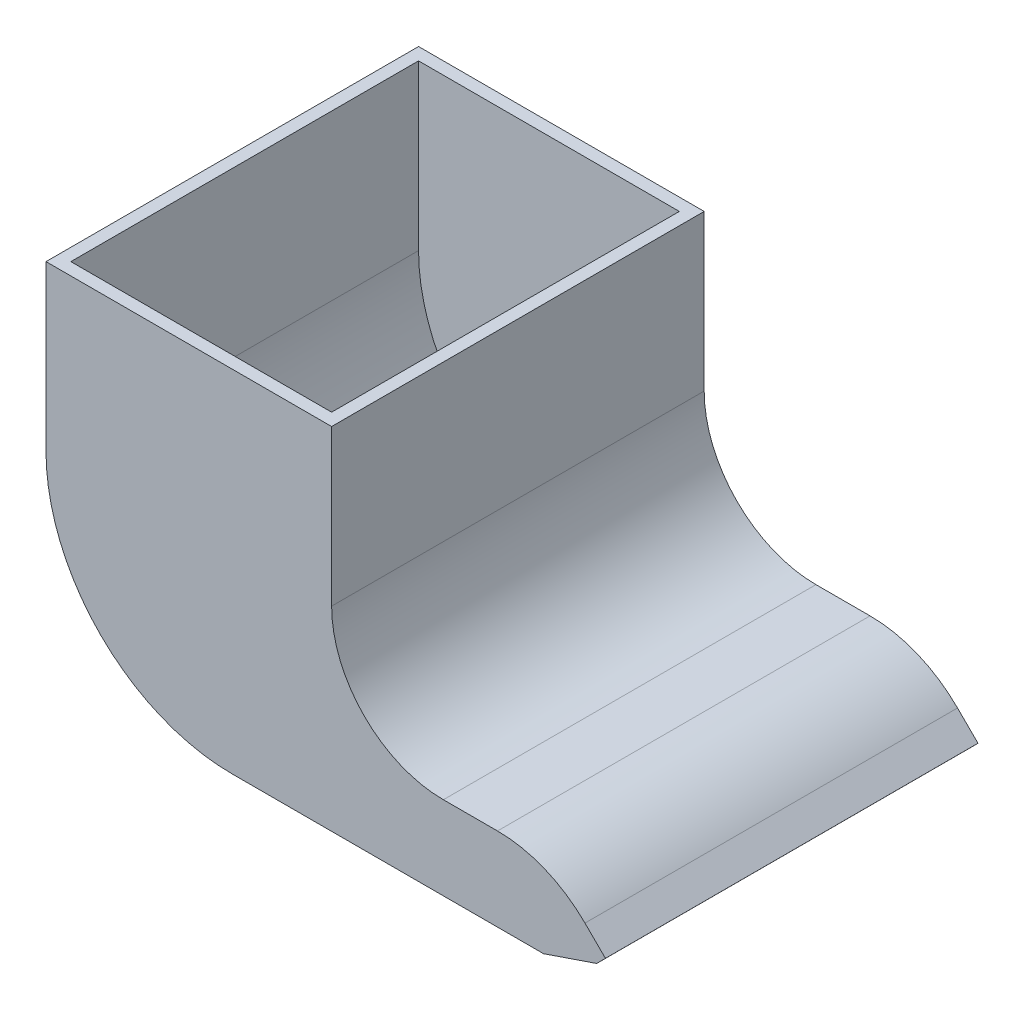
ISO-10303-21;
HEADER;
FILE_DESCRIPTION(('STEP AP214'),'2;1');
FILE_NAME('part.step','',(''),(''),'','','');
FILE_SCHEMA(('AUTOMOTIVE_DESIGN { 1 0 10303 214 1 1 1 1 }'));
ENDSEC;
DATA;
#1=APPLICATION_CONTEXT('core data for automotive mechanical design processes');
#2=APPLICATION_PROTOCOL_DEFINITION('international standard','automotive_design',2000,#1);
#3=PRODUCT_CONTEXT('',#1,'mechanical');
#4=PRODUCT('Part','Part','',(#3));
#5=PRODUCT_RELATED_PRODUCT_CATEGORY('part','',(#4));
#6=PRODUCT_DEFINITION_FORMATION('','',#4);
#7=PRODUCT_DEFINITION_CONTEXT('part definition',#1,'design');
#8=PRODUCT_DEFINITION('design','',#6,#7);
#9=PRODUCT_DEFINITION_SHAPE('','',#8);
#10=(LENGTH_UNIT() NAMED_UNIT(*) SI_UNIT(.MILLI.,.METRE.));
#11=(NAMED_UNIT(*) PLANE_ANGLE_UNIT() SI_UNIT($,.RADIAN.));
#12=(NAMED_UNIT(*) SI_UNIT($,.STERADIAN.) SOLID_ANGLE_UNIT());
#13=UNCERTAINTY_MEASURE_WITH_UNIT(LENGTH_MEASURE(1.E-05),#10,'distance_accuracy_value','');
#14=(GEOMETRIC_REPRESENTATION_CONTEXT(3) GLOBAL_UNCERTAINTY_ASSIGNED_CONTEXT((#13)) GLOBAL_UNIT_ASSIGNED_CONTEXT((#10,
#11,#12)) REPRESENTATION_CONTEXT('',''));
#15=CARTESIAN_POINT('',(0.,0.,0.));
#16=DIRECTION('',(0.,0.,1.));
#17=DIRECTION('',(1.,0.,0.));
#18=AXIS2_PLACEMENT_3D('',#15,#16,#17);
#19=CARTESIAN_POINT('',(15.0000000000001,-27.2322210697608,30.));
#20=DIRECTION('',(0.,1.,0.));
#21=DIRECTION('',(0.,0.,1.));
#22=AXIS2_PLACEMENT_3D('',#19,#20,#21);
#23=PLANE('',#22);
#24=DIRECTION('',(1.,0.,0.));
#25=VECTOR('',#24,1.);
#26=CARTESIAN_POINT('',(15.0000000000001,-27.2322210697608,29.));
#27=LINE('',#26,#25);
#28=CARTESIAN_POINT('',(15.0000000000001,-27.2322210697608,29.));
#29=VERTEX_POINT('',#28);
#30=CARTESIAN_POINT('',(37.0648175896805,-27.2322210697608,29.));
#31=VERTEX_POINT('',#30);
#32=EDGE_CURVE('E265',#29,#31,#27,.T.);
#33=ORIENTED_EDGE('',*,*,#32,.T.);
#34=DIRECTION('',(0.,0.,-1.));
#35=VECTOR('',#34,1.);
#36=CARTESIAN_POINT('',(37.0648175896805,-27.2322210697608,1.));
#37=LINE('',#36,#35);
#38=CARTESIAN_POINT('',(37.0648175896805,-27.2322210697608,1.));
#39=VERTEX_POINT('',#38);
#40=EDGE_CURVE('E418',#31,#39,#37,.T.);
#41=ORIENTED_EDGE('',*,*,#40,.T.);
#42=DIRECTION('',(-1.,0.,0.));
#43=VECTOR('',#42,1.);
#44=CARTESIAN_POINT('',(15.0000000000001,-27.2322210697608,1.));
#45=LINE('',#44,#43);
#46=CARTESIAN_POINT('',(15.0000000000001,-27.2322210697608,1.));
#47=VERTEX_POINT('',#46);
#48=EDGE_CURVE('E294',#39,#47,#45,.T.);
#49=ORIENTED_EDGE('',*,*,#48,.T.);
#50=DIRECTION('',(0.,0.,-1.));
#51=VECTOR('',#50,1.);
#52=CARTESIAN_POINT('',(15.0000000000001,-27.2322210697608,30.));
#53=LINE('',#52,#51);
#54=EDGE_CURVE('E385',#29,#47,#53,.T.);
#55=ORIENTED_EDGE('',*,*,#54,.F.);
#56=EDGE_LOOP('',(#33,#41,#49,#55));
#57=FACE_BOUND('',#56,.T.);
#58=ADVANCED_FACE('F103',(#57),#23,.T.);
#59=CARTESIAN_POINT('',(15.,-13.2322210697608,30.));
#60=DIRECTION('',(0.,0.,-1.));
#61=DIRECTION('',(-1.,0.,0.));
#62=AXIS2_PLACEMENT_3D('',#59,#60,#61);
#63=CYLINDRICAL_SURFACE('',#62,14.);
#64=ORIENTED_EDGE('',*,*,#54,.T.);
#65=CARTESIAN_POINT('',(15.,-13.2322210697608,1.));
#66=DIRECTION('',(0.,0.,-1.));
#67=DIRECTION('',(-1.,0.,0.));
#68=AXIS2_PLACEMENT_3D('',#65,#66,#67);
#69=CIRCLE('',#68,14.);
#70=CARTESIAN_POINT('',(1.,-13.2322210697607,1.));
#71=VERTEX_POINT('',#70);
#72=EDGE_CURVE('E292',#47,#71,#69,.T.);
#73=ORIENTED_EDGE('',*,*,#72,.T.);
#74=DIRECTION('',(0.,0.,-1.));
#75=VECTOR('',#74,1.);
#76=CARTESIAN_POINT('',(1.,-13.2322210697607,30.));
#77=LINE('',#76,#75);
#78=CARTESIAN_POINT('',(1.,-13.2322210697607,29.));
#79=VERTEX_POINT('',#78);
#80=EDGE_CURVE('E382',#79,#71,#77,.T.);
#81=ORIENTED_EDGE('',*,*,#80,.F.);
#82=CARTESIAN_POINT('',(15.,-13.2322210697608,29.));
#83=DIRECTION('',(0.,0.,1.));
#84=DIRECTION('',(1.,0.,0.));
#85=AXIS2_PLACEMENT_3D('',#82,#83,#84);
#86=CIRCLE('',#85,14.);
#87=EDGE_CURVE('E357',#79,#29,#86,.T.);
#88=ORIENTED_EDGE('',*,*,#87,.T.);
#89=EDGE_LOOP('',(#64,#73,#81,#88));
#90=FACE_BOUND('',#89,.T.);
#91=ADVANCED_FACE('F428',(#90),#63,.F.);
#92=CARTESIAN_POINT('',(1.,0.,30.));
#93=DIRECTION('',(1.,0.,0.));
#94=DIRECTION('',(0.,0.,-1.));
#95=AXIS2_PLACEMENT_3D('',#92,#93,#94);
#96=PLANE('',#95);
#97=ORIENTED_EDGE('',*,*,#80,.T.);
#98=DIRECTION('',(0.,1.,0.));
#99=VECTOR('',#98,1.);
#100=CARTESIAN_POINT('',(1.,0.,1.));
#101=LINE('',#100,#99);
#102=CARTESIAN_POINT('',(1.,0.,1.));
#103=VERTEX_POINT('',#102);
#104=EDGE_CURVE('E274',#71,#103,#101,.T.);
#105=ORIENTED_EDGE('',*,*,#104,.T.);
#106=DIRECTION('',(0.,0.,-1.));
#107=VECTOR('',#106,1.);
#108=CARTESIAN_POINT('',(1.,0.,30.));
#109=LINE('',#108,#107);
#110=CARTESIAN_POINT('',(1.,0.,29.));
#111=VERTEX_POINT('',#110);
#112=EDGE_CURVE('E379',#111,#103,#109,.T.);
#113=ORIENTED_EDGE('',*,*,#112,.F.);
#114=DIRECTION('',(0.,-1.,0.));
#115=VECTOR('',#114,1.);
#116=CARTESIAN_POINT('',(1.,0.,29.));
#117=LINE('',#116,#115);
#118=EDGE_CURVE('E347',#111,#79,#117,.T.);
#119=ORIENTED_EDGE('',*,*,#118,.T.);
#120=EDGE_LOOP('',(#97,#105,#113,#119));
#121=FACE_BOUND('',#120,.T.);
#122=ADVANCED_FACE('F495',(#121),#96,.T.);
#123=CARTESIAN_POINT('',(22.,-9.94197889151894,30.));
#124=DIRECTION('',(1.,0.,0.));
#125=DIRECTION('',(0.,0.,-1.));
#126=AXIS2_PLACEMENT_3D('',#123,#124,#125);
#127=PLANE('',#126);
#128=DIRECTION('',(0.,1.,0.));
#129=VECTOR('',#128,1.);
#130=CARTESIAN_POINT('',(22.,0.,1.));
#131=LINE('',#130,#129);
#132=CARTESIAN_POINT('',(22.,-12.5257490239914,1.));
#133=VERTEX_POINT('',#132);
#134=CARTESIAN_POINT('',(22.,0.,1.));
#135=VERTEX_POINT('',#134);
#136=EDGE_CURVE('E285',#133,#135,#131,.T.);
#137=ORIENTED_EDGE('',*,*,#136,.F.);
#138=DIRECTION('',(0.,0.,-1.));
#139=VECTOR('',#138,1.);
#140=CARTESIAN_POINT('',(22.,-12.5257490239914,30.));
#141=LINE('',#140,#139);
#142=CARTESIAN_POINT('',(22.,-12.5257490239914,29.));
#143=VERTEX_POINT('',#142);
#144=EDGE_CURVE('E310',#143,#133,#141,.T.);
#145=ORIENTED_EDGE('',*,*,#144,.F.);
#146=DIRECTION('',(0.,1.,0.));
#147=VECTOR('',#146,1.);
#148=CARTESIAN_POINT('',(22.,0.,29.));
#149=LINE('',#148,#147);
#150=CARTESIAN_POINT('',(22.,0.,29.));
#151=VERTEX_POINT('',#150);
#152=EDGE_CURVE('E397',#143,#151,#149,.T.);
#153=ORIENTED_EDGE('',*,*,#152,.T.);
#154=DIRECTION('',(0.,0.,-1.));
#155=VECTOR('',#154,1.);
#156=CARTESIAN_POINT('',(22.,0.,30.));
#157=LINE('',#156,#155);
#158=EDGE_CURVE('E313',#151,#135,#157,.T.);
#159=ORIENTED_EDGE('',*,*,#158,.T.);
#160=EDGE_LOOP('',(#137,#145,#153,#159));
#161=FACE_BOUND('',#160,.T.);
#162=ADVANCED_FACE('F523',(#161),#127,.F.);
#163=CARTESIAN_POINT('',(32.,-12.5257490239915,30.));
#164=DIRECTION('',(0.,0.,-1.));
#165=DIRECTION('',(-1.,0.,0.));
#166=AXIS2_PLACEMENT_3D('',#163,#164,#165);
#167=CYLINDRICAL_SURFACE('',#166,10.);
#168=CARTESIAN_POINT('',(32.,-12.5257490239915,1.));
#169=DIRECTION('',(0.,0.,-1.));
#170=DIRECTION('',(-1.,0.,0.));
#171=AXIS2_PLACEMENT_3D('',#168,#169,#170);
#172=CIRCLE('',#171,10.);
#173=CARTESIAN_POINT('',(32.0000000000001,-22.5257490239915,1.));
#174=VERTEX_POINT('',#173);
#175=EDGE_CURVE('E513',#174,#133,#172,.T.);
#176=ORIENTED_EDGE('',*,*,#175,.F.);
#177=DIRECTION('',(0.,0.,-1.));
#178=VECTOR('',#177,1.);
#179=CARTESIAN_POINT('',(32.0000000000001,-22.5257490239915,30.));
#180=LINE('',#179,#178);
#181=CARTESIAN_POINT('',(32.0000000000001,-22.5257490239915,29.));
#182=VERTEX_POINT('',#181);
#183=EDGE_CURVE('E307',#182,#174,#180,.T.);
#184=ORIENTED_EDGE('',*,*,#183,.F.);
#185=CARTESIAN_POINT('',(32.,-12.5257490239915,29.));
#186=DIRECTION('',(0.,0.,1.));
#187=DIRECTION('',(1.,0.,0.));
#188=AXIS2_PLACEMENT_3D('',#185,#186,#187);
#189=CIRCLE('',#188,10.);
#190=EDGE_CURVE('E394',#182,#143,#189,.F.);
#191=ORIENTED_EDGE('',*,*,#190,.T.);
#192=ORIENTED_EDGE('',*,*,#144,.T.);
#193=EDGE_LOOP('',(#176,#184,#191,#192));
#194=FACE_BOUND('',#193,.T.);
#195=ADVANCED_FACE('F526',(#194),#167,.T.);
#196=CARTESIAN_POINT('',(40.0648175896805,-22.5257490239915,30.));
#197=DIRECTION('',(0.,1.,0.));
#198=DIRECTION('',(0.,0.,1.));
#199=AXIS2_PLACEMENT_3D('',#196,#197,#198);
#200=PLANE('',#199);
#201=DIRECTION('',(-1.,0.,0.));
#202=VECTOR('',#201,1.);
#203=CARTESIAN_POINT('',(0.,-22.5257490239915,1.));
#204=LINE('',#203,#202);
#205=CARTESIAN_POINT('',(35.9447916422318,-22.5257490239915,1.));
#206=VERTEX_POINT('',#205);
#207=EDGE_CURVE('E512',#206,#174,#204,.T.);
#208=ORIENTED_EDGE('',*,*,#207,.F.);
#209=DIRECTION('',(0.,0.,-1.));
#210=VECTOR('',#209,1.);
#211=CARTESIAN_POINT('',(35.9447916422318,-22.5257490239915,29.));
#212=LINE('',#211,#210);
#213=CARTESIAN_POINT('',(35.9447916422318,-22.5257490239915,29.));
#214=VERTEX_POINT('',#213);
#215=EDGE_CURVE('E414',#206,#214,#212,.F.);
#216=ORIENTED_EDGE('',*,*,#215,.T.);
#217=DIRECTION('',(-1.,0.,0.));
#218=VECTOR('',#217,1.);
#219=CARTESIAN_POINT('',(0.,-22.5257490239915,29.));
#220=LINE('',#219,#218);
#221=EDGE_CURVE('E392',#214,#182,#220,.T.);
#222=ORIENTED_EDGE('',*,*,#221,.T.);
#223=ORIENTED_EDGE('',*,*,#183,.T.);
#224=EDGE_LOOP('',(#208,#216,#222,#223));
#225=FACE_BOUND('',#224,.T.);
#226=ADVANCED_FACE('F559',(#225),#200,.F.);
#227=CARTESIAN_POINT('',(40.0648175896805,-22.5257490239915,30.));
#228=DIRECTION('',(0.704430784310781,0.709772689045794,0.));
#229=DIRECTION('',(-0.709772689045794,0.704430784310781,0.));
#230=AXIS2_PLACEMENT_3D('',#227,#228,#229);
#231=PLANE('',#230);
#232=DIRECTION('',(-0.709772689045794,0.704430784310781,0.));
#233=VECTOR('',#232,1.);
#234=CARTESIAN_POINT('',(8.61852004146927,8.6838768004919,29.));
#235=LINE('',#234,#233);
#236=CARTESIAN_POINT('',(44.3447670031176,-26.7734866006109,29.));
#237=VERTEX_POINT('',#236);
#238=CARTESIAN_POINT('',(42.9890994853396,-25.4280221335336,29.));
#239=VERTEX_POINT('',#238);
#240=EDGE_CURVE('E318',#237,#239,#235,.T.);
#241=ORIENTED_EDGE('',*,*,#240,.T.);
#242=DIRECTION('',(0.,0.,-1.));
#243=VECTOR('',#242,1.);
#244=CARTESIAN_POINT('',(42.9890994853396,-25.4280221335336,1.));
#245=LINE('',#244,#243);
#246=CARTESIAN_POINT('',(42.9890994853396,-25.4280221335336,1.));
#247=VERTEX_POINT('',#246);
#248=EDGE_CURVE('E409',#239,#247,#245,.T.);
#249=ORIENTED_EDGE('',*,*,#248,.T.);
#250=DIRECTION('',(-0.709772689045794,0.704430784310781,0.));
#251=VECTOR('',#250,1.);
#252=CARTESIAN_POINT('',(8.61852004146927,8.6838768004919,1.));
#253=LINE('',#252,#251);
#254=CARTESIAN_POINT('',(44.3447670031176,-26.7734866006109,1.));
#255=VERTEX_POINT('',#254);
#256=EDGE_CURVE('E510',#255,#247,#253,.T.);
#257=ORIENTED_EDGE('',*,*,#256,.F.);
#258=DIRECTION('',(0.,0.,-1.));
#259=VECTOR('',#258,1.);
#260=CARTESIAN_POINT('',(44.3447670031176,-26.7734866006109,30.));
#261=LINE('',#260,#259);
#262=EDGE_CURVE('E315',#237,#255,#261,.T.);
#263=ORIENTED_EDGE('',*,*,#262,.F.);
#264=EDGE_LOOP('',(#241,#249,#257,#263));
#265=FACE_BOUND('',#264,.T.);
#266=ADVANCED_FACE('F509',(#265),#231,.F.);
#267=CARTESIAN_POINT('',(0.,0.,29.));
#268=DIRECTION('',(0.,0.,1.));
#269=DIRECTION('',(1.,0.,0.));
#270=AXIS2_PLACEMENT_3D('',#267,#268,#269);
#271=PLANE('',#270);
#272=ORIENTED_EDGE('',*,*,#221,.F.);
#273=CARTESIAN_POINT('',(35.9447916422318,-32.5257490239915,29.));
#274=DIRECTION('',(0.,0.,1.));
#275=DIRECTION('',(1.,0.,0.));
#276=AXIS2_PLACEMENT_3D('',#273,#274,#275);
#277=CIRCLE('',#276,10.);
#278=EDGE_CURVE('E416',#214,#239,#277,.F.);
#279=ORIENTED_EDGE('',*,*,#278,.T.);
#280=ORIENTED_EDGE('',*,*,#240,.F.);
#281=DIRECTION('',(0.946533096324317,0.322606722748769,0.));
#282=VECTOR('',#281,1.);
#283=CARTESIAN_POINT('',(12.7906826720021,-37.5280600803231,29.));
#284=LINE('',#283,#282);
#285=CARTESIAN_POINT('',(40.0648175896805,-28.2322210697608,29.));
#286=VERTEX_POINT('',#285);
#287=EDGE_CURVE('E322',#286,#237,#284,.T.);
#288=ORIENTED_EDGE('',*,*,#287,.F.);
#289=CARTESIAN_POINT('',(37.0648175896805,-32.2322210697608,29.));
#290=DIRECTION('',(0.,0.,1.));
#291=DIRECTION('',(1.,0.,0.));
#292=AXIS2_PLACEMENT_3D('',#289,#290,#291);
#293=CIRCLE('',#292,5.);
#294=EDGE_CURVE('E12',#286,#31,#293,.T.);
#295=ORIENTED_EDGE('',*,*,#294,.T.);
#296=ORIENTED_EDGE('',*,*,#32,.F.);
#297=ORIENTED_EDGE('',*,*,#87,.F.);
#298=ORIENTED_EDGE('',*,*,#118,.F.);
#299=DIRECTION('',(-1.,0.,0.));
#300=VECTOR('',#299,1.);
#301=CARTESIAN_POINT('',(0.,0.,29.));
#302=LINE('',#301,#300);
#303=EDGE_CURVE('E325',#151,#111,#302,.T.);
#304=ORIENTED_EDGE('',*,*,#303,.F.);
#305=ORIENTED_EDGE('',*,*,#152,.F.);
#306=ORIENTED_EDGE('',*,*,#190,.F.);
#307=EDGE_LOOP('',(#272,#279,#280,#288,#295,#296,#297,#298,#304,#305,#306));
#308=FACE_BOUND('',#307,.T.);
#309=ADVANCED_FACE('F433',(#308),#271,.F.);
#310=CARTESIAN_POINT('',(15.0000000000001,-28.2322210697608,30.));
#311=DIRECTION('',(0.,1.,0.));
#312=DIRECTION('',(0.,0.,1.));
#313=AXIS2_PLACEMENT_3D('',#310,#311,#312);
#314=PLANE('',#313);
#315=DIRECTION('',(0.,0.,-1.));
#316=VECTOR('',#315,1.);
#317=CARTESIAN_POINT('',(40.0648175896805,-28.2322210697608,1.));
#318=LINE('',#317,#316);
#319=CARTESIAN_POINT('',(40.0648175896805,-28.2322210697608,1.));
#320=VERTEX_POINT('',#319);
#321=CARTESIAN_POINT('',(40.0648175896805,-28.2322210697608,0.));
#322=VERTEX_POINT('',#321);
#323=EDGE_CURVE('E255',#320,#322,#318,.T.);
#324=ORIENTED_EDGE('',*,*,#323,.F.);
#325=DIRECTION('',(0.,0.,-1.));
#326=VECTOR('',#325,1.);
#327=CARTESIAN_POINT('',(40.0648175896805,-28.2322210697608,30.));
#328=LINE('',#327,#326);
#329=EDGE_CURVE('E388',#286,#320,#328,.T.);
#330=ORIENTED_EDGE('',*,*,#329,.F.);
#331=CARTESIAN_POINT('',(40.0648175896805,-28.2322210697608,30.));
#332=VERTEX_POINT('',#331);
#333=EDGE_CURVE('E389',#332,#286,#328,.T.);
#334=ORIENTED_EDGE('',*,*,#333,.F.);
#335=DIRECTION('',(1.,0.,0.));
#336=VECTOR('',#335,1.);
#337=CARTESIAN_POINT('',(15.0000000000001,-28.2322210697608,30.));
#338=LINE('',#337,#336);
#339=CARTESIAN_POINT('',(15.0000000000001,-28.2322210697608,30.));
#340=VERTEX_POINT('',#339);
#341=EDGE_CURVE('E360',#340,#332,#338,.T.);
#342=ORIENTED_EDGE('',*,*,#341,.F.);
#343=DIRECTION('',(0.,0.,-1.));
#344=VECTOR('',#343,1.);
#345=CARTESIAN_POINT('',(15.0000000000001,-28.2322210697608,30.));
#346=LINE('',#345,#344);
#347=CARTESIAN_POINT('',(15.0000000000001,-28.2322210697608,0.));
#348=VERTEX_POINT('',#347);
#349=EDGE_CURVE('E259',#340,#348,#346,.T.);
#350=ORIENTED_EDGE('',*,*,#349,.T.);
#351=DIRECTION('',(1.,0.,0.));
#352=VECTOR('',#351,1.);
#353=CARTESIAN_POINT('',(15.0000000000001,-28.2322210697608,0.));
#354=LINE('',#353,#352);
#355=EDGE_CURVE('E252',#348,#322,#354,.T.);
#356=ORIENTED_EDGE('',*,*,#355,.T.);
#357=EDGE_LOOP('',(#324,#330,#334,#342,#350,#356));
#358=FACE_BOUND('',#357,.T.);
#359=ADVANCED_FACE('F254',(#358),#314,.F.);
#360=CARTESIAN_POINT('',(0.,0.,30.));
#361=DIRECTION('',(0.,1.,0.));
#362=DIRECTION('',(0.,0.,1.));
#363=AXIS2_PLACEMENT_3D('',#360,#361,#362);
#364=PLANE('',#363);
#365=ORIENTED_EDGE('',*,*,#112,.T.);
#366=DIRECTION('',(1.,0.,0.));
#367=VECTOR('',#366,1.);
#368=CARTESIAN_POINT('',(0.,0.,1.));
#369=LINE('',#368,#367);
#370=EDGE_CURVE('E282',#103,#135,#369,.T.);
#371=ORIENTED_EDGE('',*,*,#370,.T.);
#372=ORIENTED_EDGE('',*,*,#158,.F.);
#373=ORIENTED_EDGE('',*,*,#303,.T.);
#374=EDGE_LOOP('',(#365,#371,#372,#373));
#375=FACE_BOUND('',#374,.T.);
#376=DIRECTION('',(1.,0.,0.));
#377=VECTOR('',#376,1.);
#378=CARTESIAN_POINT('',(0.,0.,0.));
#379=LINE('',#378,#377);
#380=CARTESIAN_POINT('',(0.,0.,0.));
#381=VERTEX_POINT('',#380);
#382=CARTESIAN_POINT('',(23.,0.,0.));
#383=VERTEX_POINT('',#382);
#384=EDGE_CURVE('E264',#381,#383,#379,.T.);
#385=ORIENTED_EDGE('',*,*,#384,.F.);
#386=DIRECTION('',(0.,0.,-1.));
#387=VECTOR('',#386,1.);
#388=CARTESIAN_POINT('',(0.,0.,30.));
#389=LINE('',#388,#387);
#390=CARTESIAN_POINT('',(0.,0.,30.));
#391=VERTEX_POINT('',#390);
#392=EDGE_CURVE('E377',#391,#381,#389,.T.);
#393=ORIENTED_EDGE('',*,*,#392,.F.);
#394=DIRECTION('',(1.,0.,0.));
#395=VECTOR('',#394,1.);
#396=CARTESIAN_POINT('',(0.,0.,30.));
#397=LINE('',#396,#395);
#398=CARTESIAN_POINT('',(23.,0.,30.));
#399=VERTEX_POINT('',#398);
#400=EDGE_CURVE('E362',#391,#399,#397,.T.);
#401=ORIENTED_EDGE('',*,*,#400,.T.);
#402=DIRECTION('',(0.,0.,1.));
#403=VECTOR('',#402,1.);
#404=CARTESIAN_POINT('',(23.,0.,29.));
#405=LINE('',#404,#403);
#406=EDGE_CURVE('E344',#383,#399,#405,.T.);
#407=ORIENTED_EDGE('',*,*,#406,.F.);
#408=EDGE_LOOP('',(#385,#393,#401,#407));
#409=FACE_BOUND('',#408,.T.);
#410=ADVANCED_FACE('F461',(#375,#409),#364,.T.);
#411=CARTESIAN_POINT('',(0.,-9.94197889151894,30.));
#412=DIRECTION('',(1.,0.,0.));
#413=DIRECTION('',(0.,0.,-1.));
#414=AXIS2_PLACEMENT_3D('',#411,#412,#413);
#415=PLANE('',#414);
#416=DIRECTION('',(0.,-1.,0.));
#417=VECTOR('',#416,1.);
#418=CARTESIAN_POINT('',(0.,-9.94197889151894,0.));
#419=LINE('',#418,#417);
#420=CARTESIAN_POINT('',(0.,-13.2322210697606,0.));
#421=VERTEX_POINT('',#420);
#422=EDGE_CURVE('E370',#381,#421,#419,.T.);
#423=ORIENTED_EDGE('',*,*,#422,.T.);
#424=DIRECTION('',(0.,0.,-1.));
#425=VECTOR('',#424,1.);
#426=CARTESIAN_POINT('',(0.,-13.2322210697606,30.));
#427=LINE('',#426,#425);
#428=CARTESIAN_POINT('',(0.,-13.2322210697606,30.));
#429=VERTEX_POINT('',#428);
#430=EDGE_CURVE('E375',#429,#421,#427,.T.);
#431=ORIENTED_EDGE('',*,*,#430,.F.);
#432=DIRECTION('',(0.,-1.,0.));
#433=VECTOR('',#432,1.);
#434=CARTESIAN_POINT('',(0.,0.,30.));
#435=LINE('',#434,#433);
#436=EDGE_CURVE('E365',#391,#429,#435,.T.);
#437=ORIENTED_EDGE('',*,*,#436,.F.);
#438=ORIENTED_EDGE('',*,*,#392,.T.);
#439=EDGE_LOOP('',(#423,#431,#437,#438));
#440=FACE_BOUND('',#439,.T.);
#441=ADVANCED_FACE('F540',(#440),#415,.F.);
#442=CARTESIAN_POINT('',(15.,-13.2322210697608,30.));
#443=DIRECTION('',(0.,0.,-1.));
#444=DIRECTION('',(-1.,0.,0.));
#445=AXIS2_PLACEMENT_3D('',#442,#443,#444);
#446=CYLINDRICAL_SURFACE('',#445,15.);
#447=CARTESIAN_POINT('',(15.,-13.2322210697608,0.));
#448=DIRECTION('',(0.,0.,1.));
#449=DIRECTION('',(1.,0.,0.));
#450=AXIS2_PLACEMENT_3D('',#447,#448,#449);
#451=CIRCLE('',#450,15.);
#452=EDGE_CURVE('E363',#421,#348,#451,.T.);
#453=ORIENTED_EDGE('',*,*,#452,.T.);
#454=ORIENTED_EDGE('',*,*,#349,.F.);
#455=CARTESIAN_POINT('',(15.,-13.2322210697608,30.));
#456=DIRECTION('',(0.,0.,1.));
#457=DIRECTION('',(1.,0.,0.));
#458=AXIS2_PLACEMENT_3D('',#455,#456,#457);
#459=CIRCLE('',#458,15.);
#460=EDGE_CURVE('E367',#429,#340,#459,.T.);
#461=ORIENTED_EDGE('',*,*,#460,.F.);
#462=ORIENTED_EDGE('',*,*,#430,.T.);
#463=EDGE_LOOP('',(#453,#454,#461,#462));
#464=FACE_BOUND('',#463,.T.);
#465=ADVANCED_FACE('F455',(#464),#446,.T.);
#466=CARTESIAN_POINT('',(15.,-13.2322210697608,30.));
#467=DIRECTION('',(0.,0.,1.));
#468=DIRECTION('',(1.,0.,0.));
#469=AXIS2_PLACEMENT_3D('',#466,#467,#468);
#470=PLANE('',#469);
#471=DIRECTION('',(-0.709772689045794,0.704430784310782,0.));
#472=VECTOR('',#471,1.);
#473=CARTESIAN_POINT('',(9.32295082578007,9.39364948953771,30.));
#474=LINE('',#473,#472);
#475=CARTESIAN_POINT('',(45.0491977874284,-26.0637139115651,30.));
#476=VERTEX_POINT('',#475);
#477=CARTESIAN_POINT('',(43.4011020800845,-24.4280221335336,30.));
#478=VERTEX_POINT('',#477);
#479=EDGE_CURVE('E334',#476,#478,#474,.T.);
#480=ORIENTED_EDGE('',*,*,#479,.T.);
#481=CARTESIAN_POINT('',(36.3567942369767,-31.5257490239915,30.));
#482=DIRECTION('',(0.,0.,1.));
#483=DIRECTION('',(1.,0.,0.));
#484=AXIS2_PLACEMENT_3D('',#481,#482,#483);
#485=CIRCLE('',#484,10.);
#486=CARTESIAN_POINT('',(36.3567942369767,-21.5257490239915,30.));
#487=VERTEX_POINT('',#486);
#488=EDGE_CURVE('E403',#478,#487,#485,.T.);
#489=ORIENTED_EDGE('',*,*,#488,.T.);
#490=DIRECTION('',(1.,0.,0.));
#491=VECTOR('',#490,1.);
#492=CARTESIAN_POINT('',(0.,-21.5257490239915,30.));
#493=LINE('',#492,#491);
#494=CARTESIAN_POINT('',(32.0000000000001,-21.5257490239915,30.));
#495=VERTEX_POINT('',#494);
#496=EDGE_CURVE('E337',#495,#487,#493,.T.);
#497=ORIENTED_EDGE('',*,*,#496,.F.);
#498=CARTESIAN_POINT('',(32.0000000000001,-12.5257490239914,30.));
#499=DIRECTION('',(0.,0.,1.));
#500=DIRECTION('',(1.,0.,0.));
#501=AXIS2_PLACEMENT_3D('',#498,#499,#500);
#502=CIRCLE('',#501,9.00000000000007);
#503=CARTESIAN_POINT('',(23.,-12.5257490239914,30.));
#504=VERTEX_POINT('',#503);
#505=EDGE_CURVE('E340',#504,#495,#502,.T.);
#506=ORIENTED_EDGE('',*,*,#505,.F.);
#507=DIRECTION('',(0.,1.,0.));
#508=VECTOR('',#507,1.);
#509=CARTESIAN_POINT('',(23.,0.,30.));
#510=LINE('',#509,#508);
#511=EDGE_CURVE('E326',#504,#399,#510,.T.);
#512=ORIENTED_EDGE('',*,*,#511,.T.);
#513=ORIENTED_EDGE('',*,*,#400,.F.);
#514=ORIENTED_EDGE('',*,*,#436,.T.);
#515=ORIENTED_EDGE('',*,*,#460,.T.);
#516=ORIENTED_EDGE('',*,*,#341,.T.);
#517=DIRECTION('',(0.946533096324317,0.322606722748769,0.));
#518=VECTOR('',#517,1.);
#519=CARTESIAN_POINT('',(12.7906826720021,-37.5280600803231,30.));
#520=LINE('',#519,#518);
#521=CARTESIAN_POINT('',(44.3447670031176,-26.7734866006109,30.));
#522=VERTEX_POINT('',#521);
#523=EDGE_CURVE('E321',#332,#522,#520,.T.);
#524=ORIENTED_EDGE('',*,*,#523,.T.);
#525=DIRECTION('',(0.704430784310782,0.709772689045793,0.));
#526=VECTOR('',#525,1.);
#527=CARTESIAN_POINT('',(35.7262469616483,-35.4573634011028,30.));
#528=LINE('',#527,#526);
#529=EDGE_CURVE('E331',#522,#476,#528,.T.);
#530=ORIENTED_EDGE('',*,*,#529,.T.);
#531=EDGE_LOOP('',(#480,#489,#497,#506,#512,#513,#514,#515,#516,#524,#530));
#532=FACE_BOUND('',#531,.T.);
#533=ADVANCED_FACE('F449',(#532),#470,.T.);
#534=CARTESIAN_POINT('',(15.,-13.2322210697608,0.));
#535=DIRECTION('',(0.,0.,1.));
#536=DIRECTION('',(1.,0.,0.));
#537=AXIS2_PLACEMENT_3D('',#534,#535,#536);
#538=PLANE('',#537);
#539=DIRECTION('',(1.,0.,0.));
#540=VECTOR('',#539,1.);
#541=CARTESIAN_POINT('',(40.0648175896805,-21.5257490239915,0.));
#542=LINE('',#541,#540);
#543=CARTESIAN_POINT('',(32.0000000000001,-21.5257490239915,0.));
#544=VERTEX_POINT('',#543);
#545=CARTESIAN_POINT('',(36.3567942369767,-21.5257490239915,0.));
#546=VERTEX_POINT('',#545);
#547=EDGE_CURVE('E299',#544,#546,#542,.T.);
#548=ORIENTED_EDGE('',*,*,#547,.T.);
#549=CARTESIAN_POINT('',(36.3567942369767,-31.5257490239915,0.));
#550=DIRECTION('',(0.,0.,1.));
#551=DIRECTION('',(1.,0.,0.));
#552=AXIS2_PLACEMENT_3D('',#549,#550,#551);
#553=CIRCLE('',#552,10.);
#554=CARTESIAN_POINT('',(43.4011020800845,-24.4280221335336,0.));
#555=VERTEX_POINT('',#554);
#556=EDGE_CURVE('E407',#546,#555,#553,.F.);
#557=ORIENTED_EDGE('',*,*,#556,.T.);
#558=DIRECTION('',(0.709772689045794,-0.704430784310781,0.));
#559=VECTOR('',#558,1.);
#560=CARTESIAN_POINT('',(40.7692483739913,-21.8159763349457,0.));
#561=LINE('',#560,#559);
#562=CARTESIAN_POINT('',(45.0491977874284,-26.0637139115651,0.));
#563=VERTEX_POINT('',#562);
#564=EDGE_CURVE('E297',#555,#563,#561,.T.);
#565=ORIENTED_EDGE('',*,*,#564,.T.);
#566=DIRECTION('',(-0.704430784310782,-0.709772689045793,0.));
#567=VECTOR('',#566,1.);
#568=CARTESIAN_POINT('',(45.0491977874284,-26.0637139115651,0.));
#569=LINE('',#568,#567);
#570=CARTESIAN_POINT('',(44.3447670031176,-26.7734866006109,0.));
#571=VERTEX_POINT('',#570);
#572=EDGE_CURVE('E281',#563,#571,#569,.T.);
#573=ORIENTED_EDGE('',*,*,#572,.T.);
#574=DIRECTION('',(0.946533096324317,0.322606722748769,0.));
#575=VECTOR('',#574,1.);
#576=CARTESIAN_POINT('',(12.7906826720021,-37.5280600803231,0.));
#577=LINE('',#576,#575);
#578=EDGE_CURVE('E271',#322,#571,#577,.T.);
#579=ORIENTED_EDGE('',*,*,#578,.F.);
#580=ORIENTED_EDGE('',*,*,#355,.F.);
#581=ORIENTED_EDGE('',*,*,#452,.F.);
#582=ORIENTED_EDGE('',*,*,#422,.F.);
#583=ORIENTED_EDGE('',*,*,#384,.T.);
#584=DIRECTION('',(0.,1.,0.));
#585=VECTOR('',#584,1.);
#586=CARTESIAN_POINT('',(23.,0.,0.));
#587=LINE('',#586,#585);
#588=CARTESIAN_POINT('',(23.,-12.5257490239914,0.));
#589=VERTEX_POINT('',#588);
#590=EDGE_CURVE('E304',#383,#589,#587,.F.);
#591=ORIENTED_EDGE('',*,*,#590,.T.);
#592=CARTESIAN_POINT('',(32.,-12.5257490239915,0.));
#593=DIRECTION('',(0.,0.,1.));
#594=DIRECTION('',(1.,0.,0.));
#595=AXIS2_PLACEMENT_3D('',#592,#593,#594);
#596=CIRCLE('',#595,9.);
#597=EDGE_CURVE('E301',#589,#544,#596,.T.);
#598=ORIENTED_EDGE('',*,*,#597,.T.);
#599=EDGE_LOOP('',(#548,#557,#565,#573,#579,#580,#581,#582,#583,#591,#598));
#600=FACE_BOUND('',#599,.T.);
#601=ADVANCED_FACE('F279',(#600),#538,.F.);
#602=CARTESIAN_POINT('',(23.,0.,29.));
#603=DIRECTION('',(1.,0.,0.));
#604=DIRECTION('',(0.,0.,-1.));
#605=AXIS2_PLACEMENT_3D('',#602,#603,#604);
#606=PLANE('',#605);
#607=ORIENTED_EDGE('',*,*,#511,.F.);
#608=DIRECTION('',(0.,0.,1.));
#609=VECTOR('',#608,1.);
#610=CARTESIAN_POINT('',(23.,-12.5257490239914,29.));
#611=LINE('',#610,#609);
#612=EDGE_CURVE('E348',#589,#504,#611,.T.);
#613=ORIENTED_EDGE('',*,*,#612,.F.);
#614=ORIENTED_EDGE('',*,*,#590,.F.);
#615=ORIENTED_EDGE('',*,*,#406,.T.);
#616=EDGE_LOOP('',(#607,#613,#614,#615));
#617=FACE_BOUND('',#616,.T.);
#618=ADVANCED_FACE('F465',(#617),#606,.T.);
#619=CARTESIAN_POINT('',(32.0000000000001,-12.5257490239914,29.));
#620=DIRECTION('',(0.,0.,1.));
#621=DIRECTION('',(1.,0.,0.));
#622=AXIS2_PLACEMENT_3D('',#619,#620,#621);
#623=CYLINDRICAL_SURFACE('',#622,9.00000000000007);
#624=ORIENTED_EDGE('',*,*,#505,.T.);
#625=DIRECTION('',(0.,0.,1.));
#626=VECTOR('',#625,1.);
#627=CARTESIAN_POINT('',(32.0000000000001,-21.5257490239915,29.));
#628=LINE('',#627,#626);
#629=EDGE_CURVE('E350',#544,#495,#628,.T.);
#630=ORIENTED_EDGE('',*,*,#629,.F.);
#631=ORIENTED_EDGE('',*,*,#597,.F.);
#632=ORIENTED_EDGE('',*,*,#612,.T.);
#633=EDGE_LOOP('',(#624,#630,#631,#632));
#634=FACE_BOUND('',#633,.T.);
#635=ADVANCED_FACE('F468',(#634),#623,.F.);
#636=CARTESIAN_POINT('',(0.,-21.5257490239915,29.));
#637=DIRECTION('',(0.,-1.,0.));
#638=DIRECTION('',(0.,0.,-1.));
#639=AXIS2_PLACEMENT_3D('',#636,#637,#638);
#640=PLANE('',#639);
#641=ORIENTED_EDGE('',*,*,#496,.T.);
#642=DIRECTION('',(0.,0.,1.));
#643=VECTOR('',#642,1.);
#644=CARTESIAN_POINT('',(36.3567942369767,-21.5257490239915,0.));
#645=LINE('',#644,#643);
#646=EDGE_CURVE('E405',#487,#546,#645,.F.);
#647=ORIENTED_EDGE('',*,*,#646,.T.);
#648=ORIENTED_EDGE('',*,*,#547,.F.);
#649=ORIENTED_EDGE('',*,*,#629,.T.);
#650=EDGE_LOOP('',(#641,#647,#648,#649));
#651=FACE_BOUND('',#650,.T.);
#652=ADVANCED_FACE('F473',(#651),#640,.F.);
#653=CARTESIAN_POINT('',(9.32295082578007,9.39364948953771,29.));
#654=DIRECTION('',(0.704430784310782,0.709772689045794,0.));
#655=DIRECTION('',(-0.709772689045794,0.704430784310782,0.));
#656=AXIS2_PLACEMENT_3D('',#653,#654,#655);
#657=PLANE('',#656);
#658=ORIENTED_EDGE('',*,*,#564,.F.);
#659=DIRECTION('',(0.,0.,1.));
#660=VECTOR('',#659,1.);
#661=CARTESIAN_POINT('',(43.4011020800845,-24.4280221335336,30.));
#662=LINE('',#661,#660);
#663=EDGE_CURVE('E400',#555,#478,#662,.T.);
#664=ORIENTED_EDGE('',*,*,#663,.T.);
#665=ORIENTED_EDGE('',*,*,#479,.F.);
#666=DIRECTION('',(0.,0.,1.));
#667=VECTOR('',#666,1.);
#668=CARTESIAN_POINT('',(45.0491977874284,-26.0637139115651,29.));
#669=LINE('',#668,#667);
#670=EDGE_CURVE('E353',#563,#476,#669,.T.);
#671=ORIENTED_EDGE('',*,*,#670,.F.);
#672=EDGE_LOOP('',(#658,#664,#665,#671));
#673=FACE_BOUND('',#672,.T.);
#674=ADVANCED_FACE('F481',(#673),#657,.T.);
#675=CARTESIAN_POINT('',(35.7262469616483,-35.4573634011028,29.));
#676=DIRECTION('',(0.709772689045793,-0.704430784310782,0.));
#677=DIRECTION('',(0.704430784310782,0.709772689045793,0.));
#678=AXIS2_PLACEMENT_3D('',#675,#676,#677);
#679=PLANE('',#678);
#680=ORIENTED_EDGE('',*,*,#529,.F.);
#681=DIRECTION('',(0.,0.,1.));
#682=VECTOR('',#681,1.);
#683=CARTESIAN_POINT('',(44.3447670031176,-26.7734866006109,29.));
#684=LINE('',#683,#682);
#685=EDGE_CURVE('E328',#237,#522,#684,.T.);
#686=ORIENTED_EDGE('',*,*,#685,.F.);
#687=ORIENTED_EDGE('',*,*,#262,.T.);
#688=DIRECTION('',(0.,0.,-1.));
#689=VECTOR('',#688,1.);
#690=CARTESIAN_POINT('',(44.3447670031176,-26.7734866006109,1.));
#691=LINE('',#690,#689);
#692=EDGE_CURVE('E275',#255,#571,#691,.T.);
#693=ORIENTED_EDGE('',*,*,#692,.T.);
#694=ORIENTED_EDGE('',*,*,#572,.F.);
#695=ORIENTED_EDGE('',*,*,#670,.T.);
#696=EDGE_LOOP('',(#680,#686,#687,#693,#694,#695));
#697=FACE_BOUND('',#696,.T.);
#698=ADVANCED_FACE('F445',(#697),#679,.T.);
#699=CARTESIAN_POINT('',(12.7906826720021,-37.5280600803231,29.));
#700=DIRECTION('',(0.322606722748769,-0.946533096324317,0.));
#701=DIRECTION('',(0.946533096324317,0.322606722748769,0.));
#702=AXIS2_PLACEMENT_3D('',#699,#700,#701);
#703=PLANE('',#702);
#704=ORIENTED_EDGE('',*,*,#523,.F.);
#705=ORIENTED_EDGE('',*,*,#333,.T.);
#706=ORIENTED_EDGE('',*,*,#287,.T.);
#707=ORIENTED_EDGE('',*,*,#685,.T.);
#708=EDGE_LOOP('',(#704,#705,#706,#707));
#709=FACE_BOUND('',#708,.T.);
#710=ADVANCED_FACE('F437',(#709),#703,.T.);
#711=CARTESIAN_POINT('',(12.7906826720021,-37.5280600803231,1.));
#712=DIRECTION('',(-0.322606722748769,0.946533096324317,0.));
#713=DIRECTION('',(-0.946533096324317,-0.322606722748769,0.));
#714=AXIS2_PLACEMENT_3D('',#711,#712,#713);
#715=PLANE('',#714);
#716=ORIENTED_EDGE('',*,*,#578,.T.);
#717=ORIENTED_EDGE('',*,*,#692,.F.);
#718=DIRECTION('',(0.946533096324317,0.322606722748769,0.));
#719=VECTOR('',#718,1.);
#720=CARTESIAN_POINT('',(12.7906826720021,-37.5280600803231,1.));
#721=LINE('',#720,#719);
#722=EDGE_CURVE('E273',#320,#255,#721,.T.);
#723=ORIENTED_EDGE('',*,*,#722,.F.);
#724=ORIENTED_EDGE('',*,*,#323,.T.);
#725=EDGE_LOOP('',(#716,#717,#723,#724));
#726=FACE_BOUND('',#725,.T.);
#727=ADVANCED_FACE('F269',(#726),#715,.F.);
#728=CARTESIAN_POINT('',(0.,0.,1.));
#729=DIRECTION('',(0.,0.,-1.));
#730=DIRECTION('',(-1.,0.,0.));
#731=AXIS2_PLACEMENT_3D('',#728,#729,#730);
#732=PLANE('',#731);
#733=ORIENTED_EDGE('',*,*,#256,.T.);
#734=CARTESIAN_POINT('',(35.9447916422318,-32.5257490239915,1.));
#735=DIRECTION('',(0.,0.,-1.));
#736=DIRECTION('',(-1.,0.,0.));
#737=AXIS2_PLACEMENT_3D('',#734,#735,#736);
#738=CIRCLE('',#737,10.);
#739=EDGE_CURVE('E412',#247,#206,#738,.F.);
#740=ORIENTED_EDGE('',*,*,#739,.T.);
#741=ORIENTED_EDGE('',*,*,#207,.T.);
#742=ORIENTED_EDGE('',*,*,#175,.T.);
#743=ORIENTED_EDGE('',*,*,#136,.T.);
#744=ORIENTED_EDGE('',*,*,#370,.F.);
#745=ORIENTED_EDGE('',*,*,#104,.F.);
#746=ORIENTED_EDGE('',*,*,#72,.F.);
#747=ORIENTED_EDGE('',*,*,#48,.F.);
#748=CARTESIAN_POINT('',(37.0648175896805,-32.2322210697608,1.));
#749=DIRECTION('',(0.,0.,-1.));
#750=DIRECTION('',(-1.,0.,0.));
#751=AXIS2_PLACEMENT_3D('',#748,#749,#750);
#752=CIRCLE('',#751,5.);
#753=EDGE_CURVE('E111',#39,#320,#752,.T.);
#754=ORIENTED_EDGE('',*,*,#753,.T.);
#755=ORIENTED_EDGE('',*,*,#722,.T.);
#756=EDGE_LOOP('',(#733,#740,#741,#742,#743,#744,#745,#746,#747,#754,#755));
#757=FACE_BOUND('',#756,.T.);
#758=ADVANCED_FACE('F422',(#757),#732,.F.);
#759=CARTESIAN_POINT('',(36.3567942369767,-31.5257490239915,29.));
#760=DIRECTION('',(0.,0.,-1.));
#761=DIRECTION('',(-1.,0.,0.));
#762=AXIS2_PLACEMENT_3D('',#759,#760,#761);
#763=CYLINDRICAL_SURFACE('',#762,10.);
#764=ORIENTED_EDGE('',*,*,#556,.F.);
#765=ORIENTED_EDGE('',*,*,#646,.F.);
#766=ORIENTED_EDGE('',*,*,#488,.F.);
#767=ORIENTED_EDGE('',*,*,#663,.F.);
#768=EDGE_LOOP('',(#764,#765,#766,#767));
#769=FACE_BOUND('',#768,.T.);
#770=ADVANCED_FACE('F479',(#769),#763,.T.);
#771=CARTESIAN_POINT('',(35.9447916422318,-32.5257490239915,30.));
#772=DIRECTION('',(0.,0.,1.));
#773=DIRECTION('',(1.,0.,0.));
#774=AXIS2_PLACEMENT_3D('',#771,#772,#773);
#775=CYLINDRICAL_SURFACE('',#774,10.);
#776=ORIENTED_EDGE('',*,*,#278,.F.);
#777=ORIENTED_EDGE('',*,*,#215,.F.);
#778=ORIENTED_EDGE('',*,*,#739,.F.);
#779=ORIENTED_EDGE('',*,*,#248,.F.);
#780=EDGE_LOOP('',(#776,#777,#778,#779));
#781=FACE_BOUND('',#780,.T.);
#782=ADVANCED_FACE('F502',(#781),#775,.F.);
#783=CARTESIAN_POINT('',(37.0648175896805,-32.2322210697608,30.));
#784=DIRECTION('',(0.,0.,1.));
#785=DIRECTION('',(1.,0.,0.));
#786=AXIS2_PLACEMENT_3D('',#783,#784,#785);
#787=CYLINDRICAL_SURFACE('',#786,5.);
#788=ORIENTED_EDGE('',*,*,#294,.F.);
#789=ORIENTED_EDGE('',*,*,#329,.T.);
#790=ORIENTED_EDGE('',*,*,#753,.F.);
#791=ORIENTED_EDGE('',*,*,#40,.F.);
#792=EDGE_LOOP('',(#788,#789,#790,#791));
#793=FACE_BOUND('',#792,.T.);
#794=ADVANCED_FACE('F105',(#793),#787,.T.);
#795=CLOSED_SHELL('',(#58,#91,#122,#162,#195,#226,#266,#309,#359,#410,#441,#465,#533,#601,#618,
#635,#652,#674,#698,#710,#727,#758,#770,#782,#794));
#796=MANIFOLD_SOLID_BREP('B2',#795);
#797=ADVANCED_BREP_SHAPE_REPRESENTATION('',(#18,#796),#14);
#798=SHAPE_DEFINITION_REPRESENTATION(#9,#797);
ENDSEC;
END-ISO-10303-21;
